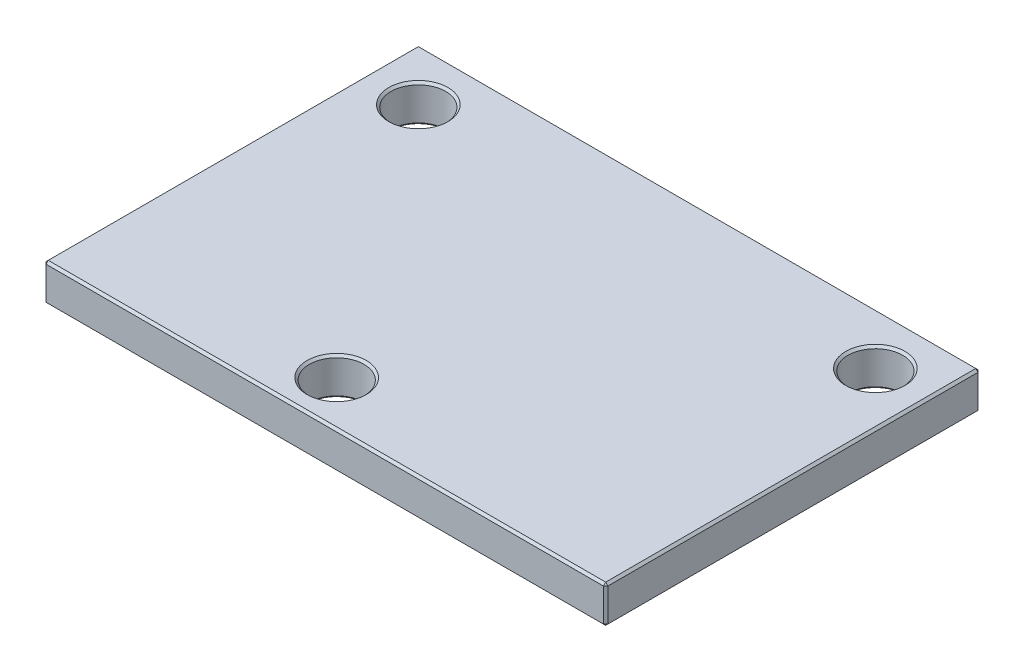
ISO-10303-21;
HEADER;
FILE_DESCRIPTION(('STEP AP214'),'2;1');
FILE_NAME('part.step','',(''),(''),'','','');
FILE_SCHEMA(('AUTOMOTIVE_DESIGN { 1 0 10303 214 1 1 1 1 }'));
ENDSEC;
DATA;
#1=APPLICATION_CONTEXT('core data for automotive mechanical design processes');
#2=APPLICATION_PROTOCOL_DEFINITION('international standard','automotive_design',2000,#1);
#3=PRODUCT_CONTEXT('',#1,'mechanical');
#4=PRODUCT('Part','Part','',(#3));
#5=PRODUCT_RELATED_PRODUCT_CATEGORY('part','',(#4));
#6=PRODUCT_DEFINITION_FORMATION('','',#4);
#7=PRODUCT_DEFINITION_CONTEXT('part definition',#1,'design');
#8=PRODUCT_DEFINITION('design','',#6,#7);
#9=PRODUCT_DEFINITION_SHAPE('','',#8);
#10=(LENGTH_UNIT() NAMED_UNIT(*) SI_UNIT(.MILLI.,.METRE.));
#11=(NAMED_UNIT(*) PLANE_ANGLE_UNIT() SI_UNIT($,.RADIAN.));
#12=(NAMED_UNIT(*) SI_UNIT($,.STERADIAN.) SOLID_ANGLE_UNIT());
#13=UNCERTAINTY_MEASURE_WITH_UNIT(LENGTH_MEASURE(1.E-05),#10,'distance_accuracy_value','');
#14=(GEOMETRIC_REPRESENTATION_CONTEXT(3) GLOBAL_UNCERTAINTY_ASSIGNED_CONTEXT((#13)) GLOBAL_UNIT_ASSIGNED_CONTEXT((#10,
#11,#12)) REPRESENTATION_CONTEXT('',''));
#15=CARTESIAN_POINT('',(0.,0.,0.));
#16=DIRECTION('',(0.,0.,1.));
#17=DIRECTION('',(1.,0.,0.));
#18=AXIS2_PLACEMENT_3D('',#15,#16,#17);
#19=CARTESIAN_POINT('',(375.,-50.,250.));
#20=DIRECTION('',(1.,0.,0.));
#21=DIRECTION('',(0.,0.,-1.));
#22=AXIS2_PLACEMENT_3D('',#19,#20,#21);
#23=PLANE('',#22);
#24=DIRECTION('',(0.,0.,-1.));
#25=VECTOR('',#24,1.);
#26=CARTESIAN_POINT('',(375.,-46.9999999999999,250.));
#27=LINE('',#26,#25);
#28=CARTESIAN_POINT('',(375.,-46.9999999999999,247.));
#29=VERTEX_POINT('',#28);
#30=CARTESIAN_POINT('',(375.,-46.9999999999999,-247.));
#31=VERTEX_POINT('',#30);
#32=EDGE_CURVE('E187',#29,#31,#27,.T.);
#33=ORIENTED_EDGE('',*,*,#32,.T.);
#34=DIRECTION('',(0.,1.,0.));
#35=VECTOR('',#34,1.);
#36=CARTESIAN_POINT('',(375.,-50.,-247.));
#37=LINE('',#36,#35);
#38=CARTESIAN_POINT('',(375.,-3.00000000000011,-247.));
#39=VERTEX_POINT('',#38);
#40=EDGE_CURVE('E189',#31,#39,#37,.T.);
#41=ORIENTED_EDGE('',*,*,#40,.T.);
#42=DIRECTION('',(0.,0.,1.));
#43=VECTOR('',#42,1.);
#44=CARTESIAN_POINT('',(375.,-3.00000000000011,250.));
#45=LINE('',#44,#43);
#46=CARTESIAN_POINT('',(375.,-3.00000000000011,247.));
#47=VERTEX_POINT('',#46);
#48=EDGE_CURVE('E183',#39,#47,#45,.T.);
#49=ORIENTED_EDGE('',*,*,#48,.T.);
#50=DIRECTION('',(0.,-1.,0.));
#51=VECTOR('',#50,1.);
#52=CARTESIAN_POINT('',(375.,-50.,247.));
#53=LINE('',#52,#51);
#54=EDGE_CURVE('E185',#47,#29,#53,.T.);
#55=ORIENTED_EDGE('',*,*,#54,.T.);
#56=EDGE_LOOP('',(#33,#41,#49,#55));
#57=FACE_BOUND('',#56,.T.);
#58=ADVANCED_FACE('F42',(#57),#23,.T.);
#59=CARTESIAN_POINT('',(-375.,-50.,250.));
#60=DIRECTION('',(0.,0.,1.));
#61=DIRECTION('',(1.,0.,0.));
#62=AXIS2_PLACEMENT_3D('',#59,#60,#61);
#63=PLANE('',#62);
#64=DIRECTION('',(-1.,0.,0.));
#65=VECTOR('',#64,1.);
#66=CARTESIAN_POINT('',(-375.,-3.00000000000011,250.));
#67=LINE('',#66,#65);
#68=CARTESIAN_POINT('',(372.,-3.00000000000011,250.));
#69=VERTEX_POINT('',#68);
#70=CARTESIAN_POINT('',(-372.,-3.00000000000011,250.));
#71=VERTEX_POINT('',#70);
#72=EDGE_CURVE('E174',#69,#71,#67,.T.);
#73=ORIENTED_EDGE('',*,*,#72,.T.);
#74=DIRECTION('',(0.,-1.,0.));
#75=VECTOR('',#74,1.);
#76=CARTESIAN_POINT('',(-372.,-50.,250.));
#77=LINE('',#76,#75);
#78=CARTESIAN_POINT('',(-372.,-46.9999999999999,250.));
#79=VERTEX_POINT('',#78);
#80=EDGE_CURVE('E180',#71,#79,#77,.T.);
#81=ORIENTED_EDGE('',*,*,#80,.T.);
#82=DIRECTION('',(1.,0.,0.));
#83=VECTOR('',#82,1.);
#84=CARTESIAN_POINT('',(-375.,-46.9999999999999,250.));
#85=LINE('',#84,#83);
#86=CARTESIAN_POINT('',(372.,-46.9999999999999,250.));
#87=VERTEX_POINT('',#86);
#88=EDGE_CURVE('E178',#79,#87,#85,.T.);
#89=ORIENTED_EDGE('',*,*,#88,.T.);
#90=DIRECTION('',(0.,1.,0.));
#91=VECTOR('',#90,1.);
#92=CARTESIAN_POINT('',(372.,-50.,250.));
#93=LINE('',#92,#91);
#94=EDGE_CURVE('E176',#87,#69,#93,.T.);
#95=ORIENTED_EDGE('',*,*,#94,.T.);
#96=EDGE_LOOP('',(#73,#81,#89,#95));
#97=FACE_BOUND('',#96,.T.);
#98=ADVANCED_FACE('F325',(#97),#63,.T.);
#99=CARTESIAN_POINT('',(-375.,-50.,250.));
#100=DIRECTION('',(-1.,0.,0.));
#101=DIRECTION('',(0.,0.,1.));
#102=AXIS2_PLACEMENT_3D('',#99,#100,#101);
#103=PLANE('',#102);
#104=DIRECTION('',(0.,-1.,0.));
#105=VECTOR('',#104,1.);
#106=CARTESIAN_POINT('',(-375.,-50.,-247.));
#107=LINE('',#106,#105);
#108=CARTESIAN_POINT('',(-375.,-3.00000000000011,-247.));
#109=VERTEX_POINT('',#108);
#110=CARTESIAN_POINT('',(-375.,-46.9999999999999,-247.));
#111=VERTEX_POINT('',#110);
#112=EDGE_CURVE('E139',#109,#111,#107,.T.);
#113=ORIENTED_EDGE('',*,*,#112,.T.);
#114=DIRECTION('',(0.,0.,1.));
#115=VECTOR('',#114,1.);
#116=CARTESIAN_POINT('',(-375.,-46.9999999999999,250.));
#117=LINE('',#116,#115);
#118=CARTESIAN_POINT('',(-375.,-46.9999999999999,247.));
#119=VERTEX_POINT('',#118);
#120=EDGE_CURVE('E172',#111,#119,#117,.T.);
#121=ORIENTED_EDGE('',*,*,#120,.T.);
#122=DIRECTION('',(0.,1.,0.));
#123=VECTOR('',#122,1.);
#124=CARTESIAN_POINT('',(-375.,-50.,247.));
#125=LINE('',#124,#123);
#126=CARTESIAN_POINT('',(-375.,-3.00000000000011,247.));
#127=VERTEX_POINT('',#126);
#128=EDGE_CURVE('E169',#119,#127,#125,.T.);
#129=ORIENTED_EDGE('',*,*,#128,.T.);
#130=DIRECTION('',(0.,0.,-1.));
#131=VECTOR('',#130,1.);
#132=CARTESIAN_POINT('',(-375.,-3.00000000000011,-250.));
#133=LINE('',#132,#131);
#134=EDGE_CURVE('E164',#127,#109,#133,.T.);
#135=ORIENTED_EDGE('',*,*,#134,.T.);
#136=EDGE_LOOP('',(#113,#121,#129,#135));
#137=FACE_BOUND('',#136,.T.);
#138=ADVANCED_FACE('F331',(#137),#103,.T.);
#139=CARTESIAN_POINT('',(-375.,-50.,-250.));
#140=DIRECTION('',(0.,0.,-1.));
#141=DIRECTION('',(-1.,0.,0.));
#142=AXIS2_PLACEMENT_3D('',#139,#140,#141);
#143=PLANE('',#142);
#144=DIRECTION('',(0.,-1.,0.));
#145=VECTOR('',#144,1.);
#146=CARTESIAN_POINT('',(372.,-50.,-250.));
#147=LINE('',#146,#145);
#148=CARTESIAN_POINT('',(372.,-3.00000000000011,-250.));
#149=VERTEX_POINT('',#148);
#150=CARTESIAN_POINT('',(372.,-46.9999999999999,-250.));
#151=VERTEX_POINT('',#150);
#152=EDGE_CURVE('E156',#149,#151,#147,.T.);
#153=ORIENTED_EDGE('',*,*,#152,.T.);
#154=DIRECTION('',(-1.,0.,0.));
#155=VECTOR('',#154,1.);
#156=CARTESIAN_POINT('',(-375.,-46.9999999999999,-250.));
#157=LINE('',#156,#155);
#158=CARTESIAN_POINT('',(-372.,-46.9999999999999,-250.));
#159=VERTEX_POINT('',#158);
#160=EDGE_CURVE('E161',#151,#159,#157,.T.);
#161=ORIENTED_EDGE('',*,*,#160,.T.);
#162=DIRECTION('',(0.,1.,0.));
#163=VECTOR('',#162,1.);
#164=CARTESIAN_POINT('',(-372.,-50.,-250.));
#165=LINE('',#164,#163);
#166=CARTESIAN_POINT('',(-372.,-3.00000000000011,-250.));
#167=VERTEX_POINT('',#166);
#168=EDGE_CURVE('E137',#159,#167,#165,.T.);
#169=ORIENTED_EDGE('',*,*,#168,.T.);
#170=DIRECTION('',(1.,0.,0.));
#171=VECTOR('',#170,1.);
#172=CARTESIAN_POINT('',(375.,-3.00000000000011,-250.));
#173=LINE('',#172,#171);
#174=EDGE_CURVE('E151',#167,#149,#173,.T.);
#175=ORIENTED_EDGE('',*,*,#174,.T.);
#176=EDGE_LOOP('',(#153,#161,#169,#175));
#177=FACE_BOUND('',#176,.T.);
#178=ADVANCED_FACE('F159',(#177),#143,.T.);
#179=CARTESIAN_POINT('',(0.,-50.,0.));
#180=DIRECTION('',(0.,-1.,0.));
#181=DIRECTION('',(0.,0.,-1.));
#182=AXIS2_PLACEMENT_3D('',#179,#180,#181);
#183=PLANE('',#182);
#184=DIRECTION('',(0.,0.,-1.));
#185=VECTOR('',#184,1.);
#186=CARTESIAN_POINT('',(-372.,-50.,0.));
#187=LINE('',#186,#185);
#188=CARTESIAN_POINT('',(-372.,-50.,247.));
#189=VERTEX_POINT('',#188);
#190=CARTESIAN_POINT('',(-372.,-50.,-247.));
#191=VERTEX_POINT('',#190);
#192=EDGE_CURVE('E196',#189,#191,#187,.T.);
#193=ORIENTED_EDGE('',*,*,#192,.T.);
#194=DIRECTION('',(1.,0.,0.));
#195=VECTOR('',#194,1.);
#196=CARTESIAN_POINT('',(0.,-50.,-247.));
#197=LINE('',#196,#195);
#198=CARTESIAN_POINT('',(372.,-50.,-247.));
#199=VERTEX_POINT('',#198);
#200=EDGE_CURVE('E198',#191,#199,#197,.T.);
#201=ORIENTED_EDGE('',*,*,#200,.T.);
#202=DIRECTION('',(0.,0.,1.));
#203=VECTOR('',#202,1.);
#204=CARTESIAN_POINT('',(372.,-50.,0.));
#205=LINE('',#204,#203);
#206=CARTESIAN_POINT('',(372.,-50.,247.));
#207=VERTEX_POINT('',#206);
#208=EDGE_CURVE('E192',#199,#207,#205,.T.);
#209=ORIENTED_EDGE('',*,*,#208,.T.);
#210=DIRECTION('',(-1.,0.,0.));
#211=VECTOR('',#210,1.);
#212=CARTESIAN_POINT('',(0.,-50.,247.));
#213=LINE('',#212,#211);
#214=EDGE_CURVE('E194',#207,#189,#213,.T.);
#215=ORIENTED_EDGE('',*,*,#214,.T.);
#216=EDGE_LOOP('',(#193,#201,#209,#215));
#217=FACE_BOUND('',#216,.T.);
#218=CARTESIAN_POINT('',(305.,-50.,-180.));
#219=DIRECTION('',(0.,-1.,0.));
#220=DIRECTION('',(0.,0.,-1.));
#221=AXIS2_PLACEMENT_3D('',#218,#219,#220);
#222=CIRCLE('',#221,39.5000000000001);
#223=CARTESIAN_POINT('',(305.,-50.,-219.5));
#224=VERTEX_POINT('',#223);
#225=EDGE_CURVE('E273',#224,#224,#222,.F.);
#226=ORIENTED_EDGE('',*,*,#225,.T.);
#227=EDGE_LOOP('',(#226));
#228=FACE_BOUND('',#227,.T.);
#229=CARTESIAN_POINT('',(-305.,-50.,-180.));
#230=DIRECTION('',(0.,-1.,0.));
#231=DIRECTION('',(0.,0.,-1.));
#232=AXIS2_PLACEMENT_3D('',#229,#230,#231);
#233=CIRCLE('',#232,39.5000000000001);
#234=CARTESIAN_POINT('',(-305.,-50.,-219.5));
#235=VERTEX_POINT('',#234);
#236=EDGE_CURVE('E268',#235,#235,#233,.F.);
#237=ORIENTED_EDGE('',*,*,#236,.T.);
#238=EDGE_LOOP('',(#237));
#239=FACE_BOUND('',#238,.T.);
#240=CARTESIAN_POINT('',(-44.,-50.,190.));
#241=DIRECTION('',(0.,-1.,0.));
#242=DIRECTION('',(0.,0.,-1.));
#243=AXIS2_PLACEMENT_3D('',#240,#241,#242);
#244=CIRCLE('',#243,39.5000000000001);
#245=CARTESIAN_POINT('',(-44.,-50.,150.5));
#246=VERTEX_POINT('',#245);
#247=EDGE_CURVE('E262',#246,#246,#244,.F.);
#248=ORIENTED_EDGE('',*,*,#247,.T.);
#249=EDGE_LOOP('',(#248));
#250=FACE_BOUND('',#249,.T.);
#251=ADVANCED_FACE('F513',(#217,#228,#239,#250),#183,.T.);
#252=CARTESIAN_POINT('',(0.,0.,0.));
#253=DIRECTION('',(0.,-1.,0.));
#254=DIRECTION('',(0.,0.,-1.));
#255=AXIS2_PLACEMENT_3D('',#252,#253,#254);
#256=PLANE('',#255);
#257=DIRECTION('',(1.,0.,0.));
#258=VECTOR('',#257,1.);
#259=CARTESIAN_POINT('',(375.,0.,247.));
#260=LINE('',#259,#258);
#261=CARTESIAN_POINT('',(-372.,0.,247.));
#262=VERTEX_POINT('',#261);
#263=CARTESIAN_POINT('',(372.,0.,247.));
#264=VERTEX_POINT('',#263);
#265=EDGE_CURVE('E201',#262,#264,#260,.T.);
#266=ORIENTED_EDGE('',*,*,#265,.T.);
#267=DIRECTION('',(0.,0.,-1.));
#268=VECTOR('',#267,1.);
#269=CARTESIAN_POINT('',(372.,0.,-250.));
#270=LINE('',#269,#268);
#271=CARTESIAN_POINT('',(372.,0.,-247.));
#272=VERTEX_POINT('',#271);
#273=EDGE_CURVE('E11',#264,#272,#270,.T.);
#274=ORIENTED_EDGE('',*,*,#273,.T.);
#275=DIRECTION('',(-1.,0.,0.));
#276=VECTOR('',#275,1.);
#277=CARTESIAN_POINT('',(-375.,0.,-247.));
#278=LINE('',#277,#276);
#279=CARTESIAN_POINT('',(-372.,0.,-247.));
#280=VERTEX_POINT('',#279);
#281=EDGE_CURVE('E52',#272,#280,#278,.T.);
#282=ORIENTED_EDGE('',*,*,#281,.T.);
#283=DIRECTION('',(0.,0.,1.));
#284=VECTOR('',#283,1.);
#285=CARTESIAN_POINT('',(-372.,0.,250.));
#286=LINE('',#285,#284);
#287=EDGE_CURVE('E203',#280,#262,#286,.T.);
#288=ORIENTED_EDGE('',*,*,#287,.T.);
#289=EDGE_LOOP('',(#266,#274,#282,#288));
#290=FACE_BOUND('',#289,.T.);
#291=CARTESIAN_POINT('',(305.,0.,-180.));
#292=DIRECTION('',(0.,-1.,0.));
#293=DIRECTION('',(0.,0.,-1.));
#294=AXIS2_PLACEMENT_3D('',#291,#292,#293);
#295=CIRCLE('',#294,39.4999999999997);
#296=CARTESIAN_POINT('',(305.,0.,-219.5));
#297=VERTEX_POINT('',#296);
#298=EDGE_CURVE('E290',#297,#297,#295,.T.);
#299=ORIENTED_EDGE('',*,*,#298,.T.);
#300=EDGE_LOOP('',(#299));
#301=FACE_BOUND('',#300,.T.);
#302=CARTESIAN_POINT('',(-305.,0.,-180.));
#303=DIRECTION('',(0.,-1.,0.));
#304=DIRECTION('',(0.,0.,-1.));
#305=AXIS2_PLACEMENT_3D('',#302,#303,#304);
#306=CIRCLE('',#305,39.4999999999998);
#307=CARTESIAN_POINT('',(-305.,0.,-219.5));
#308=VERTEX_POINT('',#307);
#309=EDGE_CURVE('E287',#308,#308,#306,.T.);
#310=ORIENTED_EDGE('',*,*,#309,.T.);
#311=EDGE_LOOP('',(#310));
#312=FACE_BOUND('',#311,.T.);
#313=CARTESIAN_POINT('',(-44.,0.,190.));
#314=DIRECTION('',(0.,-1.,0.));
#315=DIRECTION('',(0.,0.,-1.));
#316=AXIS2_PLACEMENT_3D('',#313,#314,#315);
#317=CIRCLE('',#316,39.4999999999998);
#318=CARTESIAN_POINT('',(-44.,0.,150.5));
#319=VERTEX_POINT('',#318);
#320=EDGE_CURVE('E284',#319,#319,#317,.T.);
#321=ORIENTED_EDGE('',*,*,#320,.T.);
#322=EDGE_LOOP('',(#321));
#323=FACE_BOUND('',#322,.T.);
#324=ADVANCED_FACE('F486',(#290,#301,#312,#323),#256,.F.);
#325=CARTESIAN_POINT('',(-44.,-50.001,190.));
#326=DIRECTION('',(0.,1.,0.));
#327=DIRECTION('',(0.,0.,1.));
#328=AXIS2_PLACEMENT_3D('',#325,#326,#327);
#329=CYLINDRICAL_SURFACE('',#328,36.5);
#330=CARTESIAN_POINT('',(-44.,-46.9999999999999,190.));
#331=DIRECTION('',(0.,-1.,0.));
#332=DIRECTION('',(0.,0.,-1.));
#333=AXIS2_PLACEMENT_3D('',#330,#331,#332);
#334=CIRCLE('',#333,36.5);
#335=CARTESIAN_POINT('',(-44.,-46.9999999999999,153.5));
#336=VERTEX_POINT('',#335);
#337=EDGE_CURVE('E157',#336,#336,#334,.T.);
#338=ORIENTED_EDGE('',*,*,#337,.T.);
#339=EDGE_LOOP('',(#338));
#340=FACE_BOUND('',#339,.T.);
#341=CARTESIAN_POINT('',(-44.,-2.99999999999977,190.));
#342=DIRECTION('',(0.,-1.,0.));
#343=DIRECTION('',(0.,0.,-1.));
#344=AXIS2_PLACEMENT_3D('',#341,#342,#343);
#345=CIRCLE('',#344,36.5);
#346=CARTESIAN_POINT('',(-44.,-2.99999999999977,153.5));
#347=VERTEX_POINT('',#346);
#348=EDGE_CURVE('E299',#347,#347,#345,.F.);
#349=ORIENTED_EDGE('',*,*,#348,.T.);
#350=EDGE_LOOP('',(#349));
#351=FACE_BOUND('',#350,.T.);
#352=ADVANCED_FACE('F305',(#340,#351),#329,.F.);
#353=CARTESIAN_POINT('',(305.,-50.001,-180.));
#354=DIRECTION('',(0.,1.,0.));
#355=DIRECTION('',(0.,0.,1.));
#356=AXIS2_PLACEMENT_3D('',#353,#354,#355);
#357=CYLINDRICAL_SURFACE('',#356,36.5);
#358=CARTESIAN_POINT('',(305.,-46.9999999999999,-180.));
#359=DIRECTION('',(0.,-1.,0.));
#360=DIRECTION('',(0.,0.,-1.));
#361=AXIS2_PLACEMENT_3D('',#358,#359,#360);
#362=CIRCLE('',#361,36.5);
#363=CARTESIAN_POINT('',(305.,-46.9999999999999,-216.5));
#364=VERTEX_POINT('',#363);
#365=EDGE_CURVE('E281',#364,#364,#362,.T.);
#366=ORIENTED_EDGE('',*,*,#365,.T.);
#367=EDGE_LOOP('',(#366));
#368=FACE_BOUND('',#367,.T.);
#369=CARTESIAN_POINT('',(305.,-2.99999999999981,-180.));
#370=DIRECTION('',(0.,-1.,0.));
#371=DIRECTION('',(0.,0.,-1.));
#372=AXIS2_PLACEMENT_3D('',#369,#370,#371);
#373=CIRCLE('',#372,36.5);
#374=CARTESIAN_POINT('',(305.,-2.99999999999981,-216.5));
#375=VERTEX_POINT('',#374);
#376=EDGE_CURVE('E278',#375,#375,#373,.F.);
#377=ORIENTED_EDGE('',*,*,#376,.T.);
#378=EDGE_LOOP('',(#377));
#379=FACE_BOUND('',#378,.T.);
#380=ADVANCED_FACE('F599',(#368,#379),#357,.F.);
#381=CARTESIAN_POINT('',(-305.,-50.001,-180.));
#382=DIRECTION('',(0.,1.,0.));
#383=DIRECTION('',(0.,0.,1.));
#384=AXIS2_PLACEMENT_3D('',#381,#382,#383);
#385=CYLINDRICAL_SURFACE('',#384,36.5);
#386=CARTESIAN_POINT('',(-305.,-46.9999999999999,-180.));
#387=DIRECTION('',(0.,-1.,0.));
#388=DIRECTION('',(0.,0.,-1.));
#389=AXIS2_PLACEMENT_3D('',#386,#387,#388);
#390=CIRCLE('',#389,36.5);
#391=CARTESIAN_POINT('',(-305.,-46.9999999999999,-216.5));
#392=VERTEX_POINT('',#391);
#393=EDGE_CURVE('E296',#392,#392,#390,.T.);
#394=ORIENTED_EDGE('',*,*,#393,.T.);
#395=EDGE_LOOP('',(#394));
#396=FACE_BOUND('',#395,.T.);
#397=CARTESIAN_POINT('',(-305.,-2.99999999999981,-180.));
#398=DIRECTION('',(0.,-1.,0.));
#399=DIRECTION('',(0.,0.,-1.));
#400=AXIS2_PLACEMENT_3D('',#397,#398,#399);
#401=CIRCLE('',#400,36.5);
#402=CARTESIAN_POINT('',(-305.,-2.99999999999981,-216.5));
#403=VERTEX_POINT('',#402);
#404=EDGE_CURVE('E293',#403,#403,#401,.F.);
#405=ORIENTED_EDGE('',*,*,#404,.T.);
#406=EDGE_LOOP('',(#405));
#407=FACE_BOUND('',#406,.T.);
#408=ADVANCED_FACE('F345',(#396,#407),#385,.F.);
#409=CARTESIAN_POINT('',(305.,-50.,-180.));
#410=DIRECTION('',(0.,-1.,0.));
#411=DIRECTION('',(0.,0.,-1.));
#412=AXIS2_PLACEMENT_3D('',#409,#410,#411);
#413=CONICAL_SURFACE('',#412,39.5000000000001,0.785398163397441);
#414=ORIENTED_EDGE('',*,*,#365,.F.);
#415=EDGE_LOOP('',(#414));
#416=FACE_BOUND('',#415,.T.);
#417=ORIENTED_EDGE('',*,*,#225,.F.);
#418=EDGE_LOOP('',(#417));
#419=FACE_BOUND('',#418,.T.);
#420=ADVANCED_FACE('F338',(#416,#419),#413,.F.);
#421=CARTESIAN_POINT('',(305.,-2.99999999999981,-180.));
#422=DIRECTION('',(0.,1.,0.));
#423=DIRECTION('',(0.,0.,1.));
#424=AXIS2_PLACEMENT_3D('',#421,#422,#423);
#425=CONICAL_SURFACE('',#424,36.5,0.785398163397441);
#426=ORIENTED_EDGE('',*,*,#298,.F.);
#427=EDGE_LOOP('',(#426));
#428=FACE_BOUND('',#427,.T.);
#429=ORIENTED_EDGE('',*,*,#376,.F.);
#430=EDGE_LOOP('',(#429));
#431=FACE_BOUND('',#430,.T.);
#432=ADVANCED_FACE('F344',(#428,#431),#425,.F.);
#433=CARTESIAN_POINT('',(-305.,-50.,-180.));
#434=DIRECTION('',(0.,-1.,0.));
#435=DIRECTION('',(0.,0.,-1.));
#436=AXIS2_PLACEMENT_3D('',#433,#434,#435);
#437=CONICAL_SURFACE('',#436,39.5000000000001,0.785398163397446);
#438=ORIENTED_EDGE('',*,*,#393,.F.);
#439=EDGE_LOOP('',(#438));
#440=FACE_BOUND('',#439,.T.);
#441=ORIENTED_EDGE('',*,*,#236,.F.);
#442=EDGE_LOOP('',(#441));
#443=FACE_BOUND('',#442,.T.);
#444=ADVANCED_FACE('F320',(#440,#443),#437,.F.);
#445=CARTESIAN_POINT('',(-305.,-2.99999999999981,-180.));
#446=DIRECTION('',(0.,1.,0.));
#447=DIRECTION('',(0.,0.,1.));
#448=AXIS2_PLACEMENT_3D('',#445,#446,#447);
#449=CONICAL_SURFACE('',#448,36.5,0.785398163397446);
#450=ORIENTED_EDGE('',*,*,#309,.F.);
#451=EDGE_LOOP('',(#450));
#452=FACE_BOUND('',#451,.T.);
#453=ORIENTED_EDGE('',*,*,#404,.F.);
#454=EDGE_LOOP('',(#453));
#455=FACE_BOUND('',#454,.T.);
#456=ADVANCED_FACE('F312',(#452,#455),#449,.F.);
#457=CARTESIAN_POINT('',(-44.,-50.,190.));
#458=DIRECTION('',(0.,-1.,0.));
#459=DIRECTION('',(0.,0.,-1.));
#460=AXIS2_PLACEMENT_3D('',#457,#458,#459);
#461=CONICAL_SURFACE('',#460,39.5000000000001,0.785398163397446);
#462=ORIENTED_EDGE('',*,*,#337,.F.);
#463=EDGE_LOOP('',(#462));
#464=FACE_BOUND('',#463,.T.);
#465=ORIENTED_EDGE('',*,*,#247,.F.);
#466=EDGE_LOOP('',(#465));
#467=FACE_BOUND('',#466,.T.);
#468=ADVANCED_FACE('F308',(#464,#467),#461,.F.);
#469=CARTESIAN_POINT('',(-44.,-2.99999999999977,190.));
#470=DIRECTION('',(0.,1.,0.));
#471=DIRECTION('',(0.,0.,1.));
#472=AXIS2_PLACEMENT_3D('',#469,#470,#471);
#473=CONICAL_SURFACE('',#472,36.5,0.785398163397446);
#474=ORIENTED_EDGE('',*,*,#320,.F.);
#475=EDGE_LOOP('',(#474));
#476=FACE_BOUND('',#475,.T.);
#477=ORIENTED_EDGE('',*,*,#348,.F.);
#478=EDGE_LOOP('',(#477));
#479=FACE_BOUND('',#478,.T.);
#480=ADVANCED_FACE('F311',(#476,#479),#473,.F.);
#481=CARTESIAN_POINT('',(372.,-50.,250.));
#482=DIRECTION('',(-0.707106781186547,0.,-0.707106781186547));
#483=DIRECTION('',(0.,1.,0.));
#484=AXIS2_PLACEMENT_3D('',#481,#482,#483);
#485=PLANE('',#484);
#486=DIRECTION('',(0.707106781186547,0.,-0.707106781186547));
#487=VECTOR('',#486,1.);
#488=CARTESIAN_POINT('',(372.,-46.9999999999999,250.));
#489=LINE('',#488,#487);
#490=EDGE_CURVE('E47',#29,#87,#489,.F.);
#491=ORIENTED_EDGE('',*,*,#490,.F.);
#492=ORIENTED_EDGE('',*,*,#54,.F.);
#493=DIRECTION('',(-0.707106781186547,0.,0.707106781186547));
#494=VECTOR('',#493,1.);
#495=CARTESIAN_POINT('',(372.,-3.00000000000011,250.));
#496=LINE('',#495,#494);
#497=EDGE_CURVE('E255',#69,#47,#496,.F.);
#498=ORIENTED_EDGE('',*,*,#497,.F.);
#499=ORIENTED_EDGE('',*,*,#94,.F.);
#500=EDGE_LOOP('',(#491,#492,#498,#499));
#501=FACE_BOUND('',#500,.T.);
#502=ADVANCED_FACE('F45',(#501),#485,.F.);
#503=CARTESIAN_POINT('',(372.,-46.9999999999999,250.));
#504=DIRECTION('',(0.577350269189626,-0.577350269189626,0.577350269189626));
#505=DIRECTION('',(0.707106781186547,0.,-0.707106781186547));
#506=AXIS2_PLACEMENT_3D('',#503,#504,#505);
#507=PLANE('',#506);
#508=DIRECTION('',(-0.707106781186547,-0.707106781186547,0.));
#509=VECTOR('',#508,1.);
#510=CARTESIAN_POINT('',(373.5,-48.4999999999999,247.));
#511=LINE('',#510,#509);
#512=EDGE_CURVE('E250',#29,#207,#511,.T.);
#513=ORIENTED_EDGE('',*,*,#512,.F.);
#514=ORIENTED_EDGE('',*,*,#490,.T.);
#515=DIRECTION('',(0.,0.707106781186547,0.707106781186547));
#516=VECTOR('',#515,1.);
#517=CARTESIAN_POINT('',(372.,-46.9999999999999,250.));
#518=LINE('',#517,#516);
#519=EDGE_CURVE('E253',#207,#87,#518,.T.);
#520=ORIENTED_EDGE('',*,*,#519,.F.);
#521=EDGE_LOOP('',(#513,#514,#520));
#522=FACE_BOUND('',#521,.T.);
#523=ADVANCED_FACE('F372',(#522),#507,.T.);
#524=CARTESIAN_POINT('',(372.,-3.00000000000011,250.));
#525=DIRECTION('',(0.577350269189626,0.577350269189626,0.577350269189626));
#526=DIRECTION('',(0.707106781186547,0.,-0.707106781186547));
#527=AXIS2_PLACEMENT_3D('',#524,#525,#526);
#528=PLANE('',#527);
#529=DIRECTION('',(0.,-0.707106781186547,0.707106781186547));
#530=VECTOR('',#529,1.);
#531=CARTESIAN_POINT('',(372.,-3.00000000000011,250.));
#532=LINE('',#531,#530);
#533=EDGE_CURVE('E244',#69,#264,#532,.F.);
#534=ORIENTED_EDGE('',*,*,#533,.F.);
#535=ORIENTED_EDGE('',*,*,#497,.T.);
#536=DIRECTION('',(-0.707106781186547,0.707106781186547,0.));
#537=VECTOR('',#536,1.);
#538=CARTESIAN_POINT('',(373.5,-1.50000000000006,247.));
#539=LINE('',#538,#537);
#540=EDGE_CURVE('E247',#264,#47,#539,.F.);
#541=ORIENTED_EDGE('',*,*,#540,.F.);
#542=EDGE_LOOP('',(#534,#535,#541));
#543=FACE_BOUND('',#542,.T.);
#544=ADVANCED_FACE('F377',(#543),#528,.T.);
#545=CARTESIAN_POINT('',(-375.,-46.9999999999999,250.));
#546=DIRECTION('',(0.,0.707106781186547,-0.707106781186547));
#547=DIRECTION('',(1.,0.,0.));
#548=AXIS2_PLACEMENT_3D('',#545,#546,#547);
#549=PLANE('',#548);
#550=ORIENTED_EDGE('',*,*,#519,.T.);
#551=ORIENTED_EDGE('',*,*,#88,.F.);
#552=DIRECTION('',(0.,-0.707106781186547,-0.707106781186547));
#553=VECTOR('',#552,1.);
#554=CARTESIAN_POINT('',(-372.,-46.9999999999999,250.));
#555=LINE('',#554,#553);
#556=EDGE_CURVE('E239',#189,#79,#555,.F.);
#557=ORIENTED_EDGE('',*,*,#556,.F.);
#558=ORIENTED_EDGE('',*,*,#214,.F.);
#559=EDGE_LOOP('',(#550,#551,#557,#558));
#560=FACE_BOUND('',#559,.T.);
#561=ADVANCED_FACE('F382',(#560),#549,.F.);
#562=CARTESIAN_POINT('',(375.,-46.9999999999999,250.));
#563=DIRECTION('',(-0.707106781186547,0.707106781186547,0.));
#564=DIRECTION('',(0.,0.,-1.));
#565=AXIS2_PLACEMENT_3D('',#562,#563,#564);
#566=PLANE('',#565);
#567=ORIENTED_EDGE('',*,*,#512,.T.);
#568=ORIENTED_EDGE('',*,*,#208,.F.);
#569=DIRECTION('',(0.707106781186547,0.707106781186547,0.));
#570=VECTOR('',#569,1.);
#571=CARTESIAN_POINT('',(373.5,-48.5,-247.));
#572=LINE('',#571,#570);
#573=EDGE_CURVE('E236',#31,#199,#572,.F.);
#574=ORIENTED_EDGE('',*,*,#573,.F.);
#575=ORIENTED_EDGE('',*,*,#32,.F.);
#576=EDGE_LOOP('',(#567,#568,#574,#575));
#577=FACE_BOUND('',#576,.T.);
#578=ADVANCED_FACE('F387',(#577),#566,.F.);
#579=CARTESIAN_POINT('',(375.,-50.,-247.));
#580=DIRECTION('',(-0.707106781186551,0.,0.707106781186544));
#581=DIRECTION('',(0.,1.,0.));
#582=AXIS2_PLACEMENT_3D('',#579,#580,#581);
#583=PLANE('',#582);
#584=DIRECTION('',(0.707106781186544,0.,0.707106781186551));
#585=VECTOR('',#584,1.);
#586=CARTESIAN_POINT('',(375.,-3.00000000000011,-247.));
#587=LINE('',#586,#585);
#588=EDGE_CURVE('E230',#39,#149,#587,.F.);
#589=ORIENTED_EDGE('',*,*,#588,.F.);
#590=ORIENTED_EDGE('',*,*,#40,.F.);
#591=DIRECTION('',(-0.707106781186544,0.,-0.707106781186551));
#592=VECTOR('',#591,1.);
#593=CARTESIAN_POINT('',(372.,-46.9999999999999,-250.));
#594=LINE('',#593,#592);
#595=EDGE_CURVE('E233',#151,#31,#594,.F.);
#596=ORIENTED_EDGE('',*,*,#595,.F.);
#597=ORIENTED_EDGE('',*,*,#152,.F.);
#598=EDGE_LOOP('',(#589,#590,#596,#597));
#599=FACE_BOUND('',#598,.T.);
#600=ADVANCED_FACE('F392',(#599),#583,.F.);
#601=CARTESIAN_POINT('',(372.,0.,0.));
#602=DIRECTION('',(0.707106781186547,0.707106781186547,0.));
#603=DIRECTION('',(0.,0.,1.));
#604=AXIS2_PLACEMENT_3D('',#601,#602,#603);
#605=PLANE('',#604);
#606=ORIENTED_EDGE('',*,*,#540,.T.);
#607=ORIENTED_EDGE('',*,*,#48,.F.);
#608=DIRECTION('',(0.707106781186547,-0.707106781186547,0.));
#609=VECTOR('',#608,1.);
#610=CARTESIAN_POINT('',(375.,-3.00000000000011,-247.));
#611=LINE('',#610,#609);
#612=EDGE_CURVE('E228',#272,#39,#611,.T.);
#613=ORIENTED_EDGE('',*,*,#612,.F.);
#614=ORIENTED_EDGE('',*,*,#273,.F.);
#615=EDGE_LOOP('',(#606,#607,#613,#614));
#616=FACE_BOUND('',#615,.T.);
#617=ADVANCED_FACE('F397',(#616),#605,.T.);
#618=CARTESIAN_POINT('',(0.,0.,247.));
#619=DIRECTION('',(0.,0.707106781186547,0.707106781186547));
#620=DIRECTION('',(-1.,0.,0.));
#621=AXIS2_PLACEMENT_3D('',#618,#619,#620);
#622=PLANE('',#621);
#623=ORIENTED_EDGE('',*,*,#533,.T.);
#624=ORIENTED_EDGE('',*,*,#265,.F.);
#625=DIRECTION('',(0.,0.707106781186547,-0.707106781186547));
#626=VECTOR('',#625,1.);
#627=CARTESIAN_POINT('',(-372.,-1.50000000000006,248.5));
#628=LINE('',#627,#626);
#629=EDGE_CURVE('E225',#71,#262,#628,.T.);
#630=ORIENTED_EDGE('',*,*,#629,.F.);
#631=ORIENTED_EDGE('',*,*,#72,.F.);
#632=EDGE_LOOP('',(#623,#624,#630,#631));
#633=FACE_BOUND('',#632,.T.);
#634=ADVANCED_FACE('F402',(#633),#622,.T.);
#635=CARTESIAN_POINT('',(-375.,-50.,247.));
#636=DIRECTION('',(0.707106781186547,0.,-0.707106781186547));
#637=DIRECTION('',(0.,1.,0.));
#638=AXIS2_PLACEMENT_3D('',#635,#636,#637);
#639=PLANE('',#638);
#640=DIRECTION('',(0.707106781186547,0.,0.707106781186547));
#641=VECTOR('',#640,1.);
#642=CARTESIAN_POINT('',(-372.,-46.9999999999999,250.));
#643=LINE('',#642,#641);
#644=EDGE_CURVE('E241',#79,#119,#643,.F.);
#645=ORIENTED_EDGE('',*,*,#644,.F.);
#646=ORIENTED_EDGE('',*,*,#80,.F.);
#647=DIRECTION('',(-0.707106781186547,0.,-0.707106781186547));
#648=VECTOR('',#647,1.);
#649=CARTESIAN_POINT('',(-375.,-3.00000000000011,247.));
#650=LINE('',#649,#648);
#651=EDGE_CURVE('E222',#127,#71,#650,.F.);
#652=ORIENTED_EDGE('',*,*,#651,.F.);
#653=ORIENTED_EDGE('',*,*,#128,.F.);
#654=EDGE_LOOP('',(#645,#646,#652,#653));
#655=FACE_BOUND('',#654,.T.);
#656=ADVANCED_FACE('F407',(#655),#639,.F.);
#657=CARTESIAN_POINT('',(-372.,-46.9999999999999,250.));
#658=DIRECTION('',(-0.577350269189626,-0.577350269189626,0.577350269189626));
#659=DIRECTION('',(0.707106781186547,0.,0.707106781186547));
#660=AXIS2_PLACEMENT_3D('',#657,#658,#659);
#661=PLANE('',#660);
#662=ORIENTED_EDGE('',*,*,#556,.T.);
#663=ORIENTED_EDGE('',*,*,#644,.T.);
#664=DIRECTION('',(-0.707106781186547,0.707106781186547,0.));
#665=VECTOR('',#664,1.);
#666=CARTESIAN_POINT('',(-373.5,-48.4999999999999,247.));
#667=LINE('',#666,#665);
#668=EDGE_CURVE('E219',#189,#119,#667,.T.);
#669=ORIENTED_EDGE('',*,*,#668,.F.);
#670=EDGE_LOOP('',(#662,#663,#669));
#671=FACE_BOUND('',#670,.T.);
#672=ADVANCED_FACE('F412',(#671),#661,.T.);
#673=CARTESIAN_POINT('',(372.,-46.9999999999999,-250.));
#674=DIRECTION('',(0.577350269189629,-0.577350269189624,-0.577350269189624));
#675=DIRECTION('',(-0.707106781186544,0.,-0.707106781186551));
#676=AXIS2_PLACEMENT_3D('',#673,#674,#675);
#677=PLANE('',#676);
#678=ORIENTED_EDGE('',*,*,#595,.T.);
#679=ORIENTED_EDGE('',*,*,#573,.T.);
#680=DIRECTION('',(0.,-0.707106781186547,0.707106781186547));
#681=VECTOR('',#680,1.);
#682=CARTESIAN_POINT('',(372.,-46.9999999999999,-250.));
#683=LINE('',#682,#681);
#684=EDGE_CURVE('E217',#151,#199,#683,.T.);
#685=ORIENTED_EDGE('',*,*,#684,.F.);
#686=EDGE_LOOP('',(#678,#679,#685));
#687=FACE_BOUND('',#686,.T.);
#688=ADVANCED_FACE('F417',(#687),#677,.T.);
#689=CARTESIAN_POINT('',(375.,-3.00000000000011,-247.));
#690=DIRECTION('',(0.577350269189629,0.577350269189624,-0.577350269189624));
#691=DIRECTION('',(-0.707106781186544,0.,-0.707106781186551));
#692=AXIS2_PLACEMENT_3D('',#689,#690,#691);
#693=PLANE('',#692);
#694=ORIENTED_EDGE('',*,*,#612,.T.);
#695=ORIENTED_EDGE('',*,*,#588,.T.);
#696=DIRECTION('',(0.,0.707106781186547,0.707106781186547));
#697=VECTOR('',#696,1.);
#698=CARTESIAN_POINT('',(372.,-1.50000000000004,-248.5));
#699=LINE('',#698,#697);
#700=EDGE_CURVE('E153',#272,#149,#699,.F.);
#701=ORIENTED_EDGE('',*,*,#700,.F.);
#702=EDGE_LOOP('',(#694,#695,#701));
#703=FACE_BOUND('',#702,.T.);
#704=ADVANCED_FACE('F422',(#703),#693,.T.);
#705=CARTESIAN_POINT('',(-375.,-3.00000000000011,247.));
#706=DIRECTION('',(-0.577350269189626,0.577350269189626,0.577350269189626));
#707=DIRECTION('',(0.707106781186547,0.,0.707106781186547));
#708=AXIS2_PLACEMENT_3D('',#705,#706,#707);
#709=PLANE('',#708);
#710=ORIENTED_EDGE('',*,*,#651,.T.);
#711=ORIENTED_EDGE('',*,*,#629,.T.);
#712=DIRECTION('',(-0.707106781186547,-0.707106781186547,0.));
#713=VECTOR('',#712,1.);
#714=CARTESIAN_POINT('',(-375.,-3.00000000000011,247.));
#715=LINE('',#714,#713);
#716=EDGE_CURVE('E213',#127,#262,#715,.F.);
#717=ORIENTED_EDGE('',*,*,#716,.F.);
#718=EDGE_LOOP('',(#710,#711,#717));
#719=FACE_BOUND('',#718,.T.);
#720=ADVANCED_FACE('F427',(#719),#709,.T.);
#721=CARTESIAN_POINT('',(-375.,-46.9999999999999,250.));
#722=DIRECTION('',(0.707106781186547,0.707106781186547,0.));
#723=DIRECTION('',(0.,0.,1.));
#724=AXIS2_PLACEMENT_3D('',#721,#722,#723);
#725=PLANE('',#724);
#726=ORIENTED_EDGE('',*,*,#668,.T.);
#727=ORIENTED_EDGE('',*,*,#120,.F.);
#728=DIRECTION('',(0.707106781186547,-0.707106781186547,0.));
#729=VECTOR('',#728,1.);
#730=CARTESIAN_POINT('',(-375.,-46.9999999999999,-247.));
#731=LINE('',#730,#729);
#732=EDGE_CURVE('E210',#191,#111,#731,.F.);
#733=ORIENTED_EDGE('',*,*,#732,.F.);
#734=ORIENTED_EDGE('',*,*,#192,.F.);
#735=EDGE_LOOP('',(#726,#727,#733,#734));
#736=FACE_BOUND('',#735,.T.);
#737=ADVANCED_FACE('F432',(#736),#725,.F.);
#738=CARTESIAN_POINT('',(-375.,-46.9999999999999,-250.));
#739=DIRECTION('',(0.,0.707106781186547,0.707106781186547));
#740=DIRECTION('',(-1.,0.,0.));
#741=AXIS2_PLACEMENT_3D('',#738,#739,#740);
#742=PLANE('',#741);
#743=ORIENTED_EDGE('',*,*,#684,.T.);
#744=ORIENTED_EDGE('',*,*,#200,.F.);
#745=DIRECTION('',(0.,0.707106781186547,-0.707106781186547));
#746=VECTOR('',#745,1.);
#747=CARTESIAN_POINT('',(-372.,-48.5,-248.5));
#748=LINE('',#747,#746);
#749=EDGE_CURVE('E149',#159,#191,#748,.F.);
#750=ORIENTED_EDGE('',*,*,#749,.F.);
#751=ORIENTED_EDGE('',*,*,#160,.F.);
#752=EDGE_LOOP('',(#743,#744,#750,#751));
#753=FACE_BOUND('',#752,.T.);
#754=ADVANCED_FACE('F437',(#753),#742,.F.);
#755=CARTESIAN_POINT('',(0.,0.,-247.));
#756=DIRECTION('',(0.,0.707106781186547,-0.707106781186547));
#757=DIRECTION('',(1.,0.,0.));
#758=AXIS2_PLACEMENT_3D('',#755,#756,#757);
#759=PLANE('',#758);
#760=ORIENTED_EDGE('',*,*,#700,.T.);
#761=ORIENTED_EDGE('',*,*,#174,.F.);
#762=DIRECTION('',(0.,-0.707106781186547,-0.707106781186547));
#763=VECTOR('',#762,1.);
#764=CARTESIAN_POINT('',(-372.,-3.00000000000011,-250.));
#765=LINE('',#764,#763);
#766=EDGE_CURVE('E144',#280,#167,#765,.T.);
#767=ORIENTED_EDGE('',*,*,#766,.F.);
#768=ORIENTED_EDGE('',*,*,#281,.F.);
#769=EDGE_LOOP('',(#760,#761,#767,#768));
#770=FACE_BOUND('',#769,.T.);
#771=ADVANCED_FACE('F152',(#770),#759,.T.);
#772=CARTESIAN_POINT('',(-372.,0.,0.));
#773=DIRECTION('',(-0.707106781186547,0.707106781186547,0.));
#774=DIRECTION('',(0.,0.,-1.));
#775=AXIS2_PLACEMENT_3D('',#772,#773,#774);
#776=PLANE('',#775);
#777=ORIENTED_EDGE('',*,*,#716,.T.);
#778=ORIENTED_EDGE('',*,*,#287,.F.);
#779=DIRECTION('',(0.707106781186547,0.707106781186547,0.));
#780=VECTOR('',#779,1.);
#781=CARTESIAN_POINT('',(-373.5,-1.50000000000004,-247.));
#782=LINE('',#781,#780);
#783=EDGE_CURVE('E148',#109,#280,#782,.T.);
#784=ORIENTED_EDGE('',*,*,#783,.F.);
#785=ORIENTED_EDGE('',*,*,#134,.F.);
#786=EDGE_LOOP('',(#777,#778,#784,#785));
#787=FACE_BOUND('',#786,.T.);
#788=ADVANCED_FACE('F446',(#787),#776,.T.);
#789=CARTESIAN_POINT('',(-375.,-46.9999999999999,-247.));
#790=DIRECTION('',(-0.577350269189629,-0.577350269189624,-0.577350269189624));
#791=DIRECTION('',(-0.707106781186544,0.,0.707106781186551));
#792=AXIS2_PLACEMENT_3D('',#789,#790,#791);
#793=PLANE('',#792);
#794=ORIENTED_EDGE('',*,*,#749,.T.);
#795=ORIENTED_EDGE('',*,*,#732,.T.);
#796=DIRECTION('',(-0.707106781186544,0.,0.707106781186551));
#797=VECTOR('',#796,1.);
#798=CARTESIAN_POINT('',(-375.,-46.9999999999999,-247.));
#799=LINE('',#798,#797);
#800=EDGE_CURVE('E142',#159,#111,#799,.T.);
#801=ORIENTED_EDGE('',*,*,#800,.F.);
#802=EDGE_LOOP('',(#794,#795,#801));
#803=FACE_BOUND('',#802,.T.);
#804=ADVANCED_FACE('F451',(#803),#793,.T.);
#805=CARTESIAN_POINT('',(-372.,-3.00000000000011,-250.));
#806=DIRECTION('',(-0.577350269189629,0.577350269189624,-0.577350269189624));
#807=DIRECTION('',(-0.707106781186544,0.,0.707106781186551));
#808=AXIS2_PLACEMENT_3D('',#805,#806,#807);
#809=PLANE('',#808);
#810=ORIENTED_EDGE('',*,*,#783,.T.);
#811=ORIENTED_EDGE('',*,*,#766,.T.);
#812=DIRECTION('',(0.707106781186544,0.,-0.707106781186551));
#813=VECTOR('',#812,1.);
#814=CARTESIAN_POINT('',(-372.,-3.00000000000011,-250.));
#815=LINE('',#814,#813);
#816=EDGE_CURVE('E133',#109,#167,#815,.T.);
#817=ORIENTED_EDGE('',*,*,#816,.F.);
#818=EDGE_LOOP('',(#810,#811,#817));
#819=FACE_BOUND('',#818,.T.);
#820=ADVANCED_FACE('F146',(#819),#809,.T.);
#821=CARTESIAN_POINT('',(-372.,-50.,-250.));
#822=DIRECTION('',(0.707106781186551,0.,0.707106781186544));
#823=DIRECTION('',(0.,1.,0.));
#824=AXIS2_PLACEMENT_3D('',#821,#822,#823);
#825=PLANE('',#824);
#826=ORIENTED_EDGE('',*,*,#800,.T.);
#827=ORIENTED_EDGE('',*,*,#112,.F.);
#828=ORIENTED_EDGE('',*,*,#816,.T.);
#829=ORIENTED_EDGE('',*,*,#168,.F.);
#830=EDGE_LOOP('',(#826,#827,#828,#829));
#831=FACE_BOUND('',#830,.T.);
#832=ADVANCED_FACE('F135',(#831),#825,.F.);
#833=CLOSED_SHELL('',(#58,#98,#138,#178,#251,#324,#352,#380,#408,#420,#432,#444,#456,#468,#480,
#502,#523,#544,#561,#578,#600,#617,#634,#656,#672,#688,#704,#720,#737,#754,#771,#788,#804,#820,#832));
#834=MANIFOLD_SOLID_BREP('B2',#833);
#835=ADVANCED_BREP_SHAPE_REPRESENTATION('',(#18,#834),#14);
#836=SHAPE_DEFINITION_REPRESENTATION(#9,#835);
ENDSEC;
END-ISO-10303-21;
